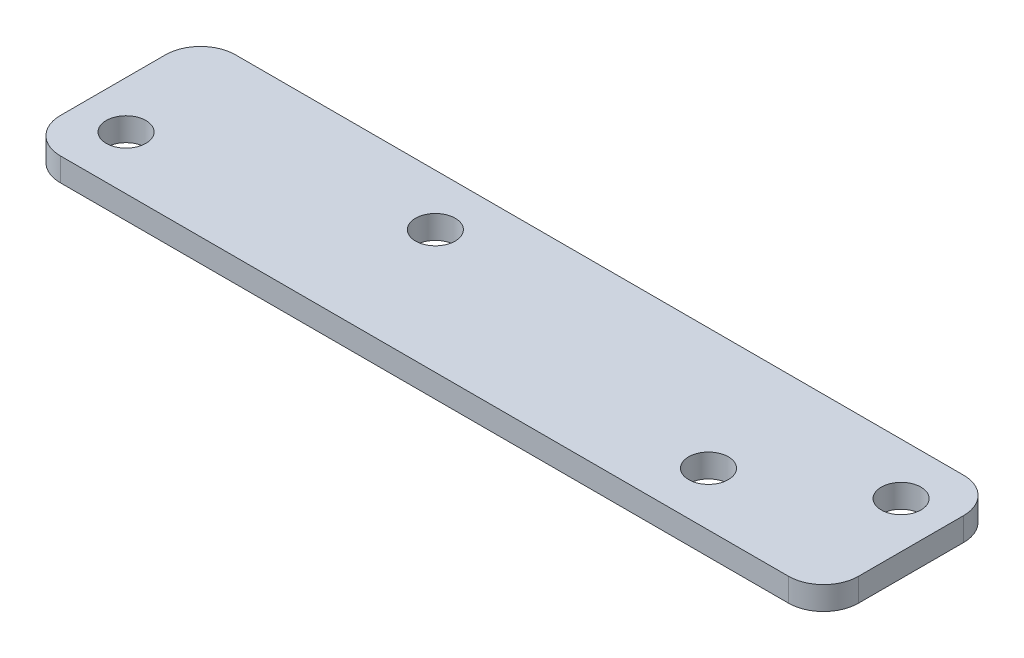
ISO-10303-21;
HEADER;
FILE_DESCRIPTION(('STEP AP214'),'2;1');
FILE_NAME('part.step','',(''),(''),'','','');
FILE_SCHEMA(('AUTOMOTIVE_DESIGN { 1 0 10303 214 1 1 1 1 }'));
ENDSEC;
DATA;
#1=APPLICATION_CONTEXT('core data for automotive mechanical design processes');
#2=APPLICATION_PROTOCOL_DEFINITION('international standard','automotive_design',2000,#1);
#3=PRODUCT_CONTEXT('',#1,'mechanical');
#4=PRODUCT('Part','Part','',(#3));
#5=PRODUCT_RELATED_PRODUCT_CATEGORY('part','',(#4));
#6=PRODUCT_DEFINITION_FORMATION('','',#4);
#7=PRODUCT_DEFINITION_CONTEXT('part definition',#1,'design');
#8=PRODUCT_DEFINITION('design','',#6,#7);
#9=PRODUCT_DEFINITION_SHAPE('','',#8);
#10=(LENGTH_UNIT() NAMED_UNIT(*) SI_UNIT(.MILLI.,.METRE.));
#11=(NAMED_UNIT(*) PLANE_ANGLE_UNIT() SI_UNIT($,.RADIAN.));
#12=(NAMED_UNIT(*) SI_UNIT($,.STERADIAN.) SOLID_ANGLE_UNIT());
#13=UNCERTAINTY_MEASURE_WITH_UNIT(LENGTH_MEASURE(1.E-05),#10,'distance_accuracy_value','');
#14=(GEOMETRIC_REPRESENTATION_CONTEXT(3) GLOBAL_UNCERTAINTY_ASSIGNED_CONTEXT((#13)) GLOBAL_UNIT_ASSIGNED_CONTEXT((#10,
#11,#12)) REPRESENTATION_CONTEXT('',''));
#15=CARTESIAN_POINT('',(0.,0.,0.));
#16=DIRECTION('',(0.,0.,1.));
#17=DIRECTION('',(1.,0.,0.));
#18=AXIS2_PLACEMENT_3D('',#15,#16,#17);
#19=CARTESIAN_POINT('',(-45.1802721977197,2.,13.3464138420318));
#20=DIRECTION('',(0.,1.,0.));
#21=DIRECTION('',(0.,0.,1.));
#22=AXIS2_PLACEMENT_3D('',#19,#20,#21);
#23=PLANE('',#22);
#24=CARTESIAN_POINT('',(-106.522840672689,2.,11.7573842534929));
#25=DIRECTION('',(0.,1.,0.));
#26=DIRECTION('',(0.,0.,1.));
#27=AXIS2_PLACEMENT_3D('',#24,#25,#26);
#28=CIRCLE('',#27,1.7);
#29=CARTESIAN_POINT('',(-106.522840672689,2.,13.4573842534929));
#30=VERTEX_POINT('',#29);
#31=EDGE_CURVE('E225',#30,#30,#28,.T.);
#32=ORIENTED_EDGE('',*,*,#31,.F.);
#33=EDGE_LOOP('',(#32));
#34=FACE_BOUND('',#33,.T.);
#35=CARTESIAN_POINT('',(-86.0228406726891,2.,5.75738425349294));
#36=DIRECTION('',(0.,1.,0.));
#37=DIRECTION('',(0.,0.,1.));
#38=AXIS2_PLACEMENT_3D('',#35,#36,#37);
#39=CIRCLE('',#38,1.7);
#40=CARTESIAN_POINT('',(-86.0228406726891,2.,7.45738425349294));
#41=VERTEX_POINT('',#40);
#42=EDGE_CURVE('E150',#41,#41,#39,.T.);
#43=ORIENTED_EDGE('',*,*,#42,.F.);
#44=EDGE_LOOP('',(#43));
#45=FACE_BOUND('',#44,.T.);
#46=CARTESIAN_POINT('',(-45.1802721977197,2.,13.3464138420318));
#47=DIRECTION('',(0.,1.,0.));
#48=DIRECTION('',(0.,0.,1.));
#49=AXIS2_PLACEMENT_3D('',#46,#47,#48);
#50=CIRCLE('',#49,3.);
#51=CARTESIAN_POINT('',(-45.1802721977197,2.,16.3464138420318));
#52=VERTEX_POINT('',#51);
#53=CARTESIAN_POINT('',(-42.1802721977197,2.,13.3464138420317));
#54=VERTEX_POINT('',#53);
#55=EDGE_CURVE('E168',#52,#54,#50,.T.);
#56=ORIENTED_EDGE('',*,*,#55,.T.);
#57=DIRECTION('',(0.,0.,-1.));
#58=VECTOR('',#57,1.);
#59=CARTESIAN_POINT('',(-42.1802721977197,2.,4.34641384203178));
#60=LINE('',#59,#58);
#61=CARTESIAN_POINT('',(-42.1802721977197,2.,4.34641384203178));
#62=VERTEX_POINT('',#61);
#63=EDGE_CURVE('E104',#54,#62,#60,.T.);
#64=ORIENTED_EDGE('',*,*,#63,.T.);
#65=CARTESIAN_POINT('',(-45.1802721977197,2.,4.34641384203176));
#66=DIRECTION('',(0.,1.,0.));
#67=DIRECTION('',(0.,0.,-1.));
#68=AXIS2_PLACEMENT_3D('',#65,#66,#67);
#69=CIRCLE('',#68,3.);
#70=CARTESIAN_POINT('',(-45.1802721977197,2.,1.34641384203176));
#71=VERTEX_POINT('',#70);
#72=EDGE_CURVE('E189',#62,#71,#69,.T.);
#73=ORIENTED_EDGE('',*,*,#72,.T.);
#74=DIRECTION('',(-1.,0.,0.));
#75=VECTOR('',#74,1.);
#76=CARTESIAN_POINT('',(-107.557379253952,2.,1.34641384203176));
#77=LINE('',#76,#75);
#78=CARTESIAN_POINT('',(-107.557379253952,2.,1.34641384203176));
#79=VERTEX_POINT('',#78);
#80=EDGE_CURVE('E203',#71,#79,#77,.T.);
#81=ORIENTED_EDGE('',*,*,#80,.T.);
#82=CARTESIAN_POINT('',(-107.557379253952,2.,4.34641384203176));
#83=DIRECTION('',(0.,1.,0.));
#84=DIRECTION('',(0.,0.,1.));
#85=AXIS2_PLACEMENT_3D('',#82,#83,#84);
#86=CIRCLE('',#85,3.);
#87=CARTESIAN_POINT('',(-110.557379253952,2.,4.34641384203178));
#88=VERTEX_POINT('',#87);
#89=EDGE_CURVE('E123',#79,#88,#86,.T.);
#90=ORIENTED_EDGE('',*,*,#89,.T.);
#91=DIRECTION('',(0.,0.,1.));
#92=VECTOR('',#91,1.);
#93=CARTESIAN_POINT('',(-110.557379253952,2.,4.34641384203178));
#94=LINE('',#93,#92);
#95=CARTESIAN_POINT('',(-110.557379253952,2.,13.3464138420317));
#96=VERTEX_POINT('',#95);
#97=EDGE_CURVE('E117',#88,#96,#94,.T.);
#98=ORIENTED_EDGE('',*,*,#97,.T.);
#99=CARTESIAN_POINT('',(-107.557379253952,2.,13.3464138420318));
#100=DIRECTION('',(0.,1.,0.));
#101=DIRECTION('',(0.,0.,1.));
#102=AXIS2_PLACEMENT_3D('',#99,#100,#101);
#103=CIRCLE('',#102,3.);
#104=CARTESIAN_POINT('',(-107.557379253952,2.,16.3464138420318));
#105=VERTEX_POINT('',#104);
#106=EDGE_CURVE('E121',#96,#105,#103,.T.);
#107=ORIENTED_EDGE('',*,*,#106,.T.);
#108=DIRECTION('',(1.,0.,0.));
#109=VECTOR('',#108,1.);
#110=CARTESIAN_POINT('',(-107.557379253952,2.,16.3464138420318));
#111=LINE('',#110,#109);
#112=EDGE_CURVE('E61',#105,#52,#111,.T.);
#113=ORIENTED_EDGE('',*,*,#112,.T.);
#114=EDGE_LOOP('',(#56,#64,#73,#81,#90,#98,#107,#113));
#115=FACE_BOUND('',#114,.T.);
#116=CARTESIAN_POINT('',(-46.1228406726891,2.,5.75738425349294));
#117=DIRECTION('',(0.,1.,0.));
#118=DIRECTION('',(0.,0.,1.));
#119=AXIS2_PLACEMENT_3D('',#116,#117,#118);
#120=CIRCLE('',#119,1.7);
#121=CARTESIAN_POINT('',(-46.1228406726891,2.,7.45738425349294));
#122=VERTEX_POINT('',#121);
#123=EDGE_CURVE('E217',#122,#122,#120,.T.);
#124=ORIENTED_EDGE('',*,*,#123,.F.);
#125=EDGE_LOOP('',(#124));
#126=FACE_BOUND('',#125,.T.);
#127=CARTESIAN_POINT('',(-56.6228406726891,2.,11.7573842534929));
#128=DIRECTION('',(0.,1.,0.));
#129=DIRECTION('',(0.,0.,1.));
#130=AXIS2_PLACEMENT_3D('',#127,#128,#129);
#131=CIRCLE('',#130,1.7);
#132=CARTESIAN_POINT('',(-56.6228406726891,2.,13.4573842534929));
#133=VERTEX_POINT('',#132);
#134=EDGE_CURVE('E233',#133,#133,#131,.T.);
#135=ORIENTED_EDGE('',*,*,#134,.F.);
#136=EDGE_LOOP('',(#135));
#137=FACE_BOUND('',#136,.T.);
#138=ADVANCED_FACE('F43',(#34,#45,#115,#126,#137),#23,.T.);
#139=CARTESIAN_POINT('',(-45.1802721977197,0.,13.3464138420318));
#140=DIRECTION('',(0.,1.,0.));
#141=DIRECTION('',(0.,0.,1.));
#142=AXIS2_PLACEMENT_3D('',#139,#140,#141);
#143=PLANE('',#142);
#144=CARTESIAN_POINT('',(-45.1802721977197,0.,13.3464138420318));
#145=DIRECTION('',(0.,1.,0.));
#146=DIRECTION('',(0.,0.,1.));
#147=AXIS2_PLACEMENT_3D('',#144,#145,#146);
#148=CIRCLE('',#147,3.);
#149=CARTESIAN_POINT('',(-45.1802721977197,0.,16.3464138420318));
#150=VERTEX_POINT('',#149);
#151=CARTESIAN_POINT('',(-42.1802721977197,0.,13.3464138420317));
#152=VERTEX_POINT('',#151);
#153=EDGE_CURVE('E145',#150,#152,#148,.T.);
#154=ORIENTED_EDGE('',*,*,#153,.F.);
#155=DIRECTION('',(1.,0.,0.));
#156=VECTOR('',#155,1.);
#157=CARTESIAN_POINT('',(-107.557379253952,0.,16.3464138420318));
#158=LINE('',#157,#156);
#159=CARTESIAN_POINT('',(-107.557379253952,0.,16.3464138420318));
#160=VERTEX_POINT('',#159);
#161=EDGE_CURVE('E96',#160,#150,#158,.T.);
#162=ORIENTED_EDGE('',*,*,#161,.F.);
#163=CARTESIAN_POINT('',(-107.557379253952,0.,13.3464138420318));
#164=DIRECTION('',(0.,1.,0.));
#165=DIRECTION('',(0.,0.,1.));
#166=AXIS2_PLACEMENT_3D('',#163,#164,#165);
#167=CIRCLE('',#166,3.);
#168=CARTESIAN_POINT('',(-110.557379253952,0.,13.3464138420317));
#169=VERTEX_POINT('',#168);
#170=EDGE_CURVE('E90',#169,#160,#167,.T.);
#171=ORIENTED_EDGE('',*,*,#170,.F.);
#172=DIRECTION('',(0.,0.,1.));
#173=VECTOR('',#172,1.);
#174=CARTESIAN_POINT('',(-110.557379253952,0.,4.34641384203178));
#175=LINE('',#174,#173);
#176=CARTESIAN_POINT('',(-110.557379253952,0.,4.34641384203178));
#177=VERTEX_POINT('',#176);
#178=EDGE_CURVE('E132',#177,#169,#175,.T.);
#179=ORIENTED_EDGE('',*,*,#178,.F.);
#180=CARTESIAN_POINT('',(-107.557379253952,0.,4.34641384203176));
#181=DIRECTION('',(0.,1.,0.));
#182=DIRECTION('',(0.,0.,1.));
#183=AXIS2_PLACEMENT_3D('',#180,#181,#182);
#184=CIRCLE('',#183,3.);
#185=CARTESIAN_POINT('',(-107.557379253952,0.,1.34641384203176));
#186=VERTEX_POINT('',#185);
#187=EDGE_CURVE('E159',#186,#177,#184,.T.);
#188=ORIENTED_EDGE('',*,*,#187,.F.);
#189=DIRECTION('',(-1.,0.,0.));
#190=VECTOR('',#189,1.);
#191=CARTESIAN_POINT('',(-107.557379253952,0.,1.34641384203176));
#192=LINE('',#191,#190);
#193=CARTESIAN_POINT('',(-45.1802721977197,0.,1.34641384203176));
#194=VERTEX_POINT('',#193);
#195=EDGE_CURVE('E156',#194,#186,#192,.T.);
#196=ORIENTED_EDGE('',*,*,#195,.F.);
#197=CARTESIAN_POINT('',(-45.1802721977197,0.,4.34641384203176));
#198=DIRECTION('',(0.,1.,0.));
#199=DIRECTION('',(0.,0.,-1.));
#200=AXIS2_PLACEMENT_3D('',#197,#198,#199);
#201=CIRCLE('',#200,3.);
#202=CARTESIAN_POINT('',(-42.1802721977197,0.,4.34641384203178));
#203=VERTEX_POINT('',#202);
#204=EDGE_CURVE('E153',#203,#194,#201,.T.);
#205=ORIENTED_EDGE('',*,*,#204,.F.);
#206=DIRECTION('',(0.,0.,-1.));
#207=VECTOR('',#206,1.);
#208=CARTESIAN_POINT('',(-42.1802721977197,0.,4.34641384203178));
#209=LINE('',#208,#207);
#210=EDGE_CURVE('E149',#152,#203,#209,.T.);
#211=ORIENTED_EDGE('',*,*,#210,.F.);
#212=EDGE_LOOP('',(#154,#162,#171,#179,#188,#196,#205,#211));
#213=FACE_BOUND('',#212,.T.);
#214=CARTESIAN_POINT('',(-86.0228406726891,0.,5.75738425349294));
#215=DIRECTION('',(0.,1.,0.));
#216=DIRECTION('',(0.,0.,1.));
#217=AXIS2_PLACEMENT_3D('',#214,#215,#216);
#218=CIRCLE('',#217,1.7);
#219=CARTESIAN_POINT('',(-86.0228406726891,0.,7.45738425349294));
#220=VERTEX_POINT('',#219);
#221=EDGE_CURVE('E213',#220,#220,#218,.T.);
#222=ORIENTED_EDGE('',*,*,#221,.T.);
#223=EDGE_LOOP('',(#222));
#224=FACE_BOUND('',#223,.T.);
#225=CARTESIAN_POINT('',(-46.1228406726891,0.,5.75738425349294));
#226=DIRECTION('',(0.,1.,0.));
#227=DIRECTION('',(0.,0.,1.));
#228=AXIS2_PLACEMENT_3D('',#225,#226,#227);
#229=CIRCLE('',#228,1.7);
#230=CARTESIAN_POINT('',(-46.1228406726891,0.,7.45738425349294));
#231=VERTEX_POINT('',#230);
#232=EDGE_CURVE('E221',#231,#231,#229,.T.);
#233=ORIENTED_EDGE('',*,*,#232,.T.);
#234=EDGE_LOOP('',(#233));
#235=FACE_BOUND('',#234,.T.);
#236=CARTESIAN_POINT('',(-106.522840672689,0.,11.7573842534929));
#237=DIRECTION('',(0.,1.,0.));
#238=DIRECTION('',(0.,0.,1.));
#239=AXIS2_PLACEMENT_3D('',#236,#237,#238);
#240=CIRCLE('',#239,1.7);
#241=CARTESIAN_POINT('',(-106.522840672689,0.,13.4573842534929));
#242=VERTEX_POINT('',#241);
#243=EDGE_CURVE('E229',#242,#242,#240,.T.);
#244=ORIENTED_EDGE('',*,*,#243,.T.);
#245=EDGE_LOOP('',(#244));
#246=FACE_BOUND('',#245,.T.);
#247=CARTESIAN_POINT('',(-56.6228406726891,0.,11.7573842534929));
#248=DIRECTION('',(0.,1.,0.));
#249=DIRECTION('',(0.,0.,1.));
#250=AXIS2_PLACEMENT_3D('',#247,#248,#249);
#251=CIRCLE('',#250,1.7);
#252=CARTESIAN_POINT('',(-56.6228406726891,0.,13.4573842534929));
#253=VERTEX_POINT('',#252);
#254=EDGE_CURVE('E237',#253,#253,#251,.T.);
#255=ORIENTED_EDGE('',*,*,#254,.T.);
#256=EDGE_LOOP('',(#255));
#257=FACE_BOUND('',#256,.T.);
#258=ADVANCED_FACE('F193',(#213,#224,#235,#246,#257),#143,.F.);
#259=CARTESIAN_POINT('',(-45.1802721977197,2.,13.3464138420318));
#260=DIRECTION('',(0.,-1.,0.));
#261=DIRECTION('',(0.,0.,-1.));
#262=AXIS2_PLACEMENT_3D('',#259,#260,#261);
#263=CYLINDRICAL_SURFACE('',#262,3.);
#264=ORIENTED_EDGE('',*,*,#153,.T.);
#265=DIRECTION('',(0.,-1.,0.));
#266=VECTOR('',#265,1.);
#267=CARTESIAN_POINT('',(-42.1802721977197,2.,13.3464138420317));
#268=LINE('',#267,#266);
#269=EDGE_CURVE('E11',#54,#152,#268,.T.);
#270=ORIENTED_EDGE('',*,*,#269,.F.);
#271=ORIENTED_EDGE('',*,*,#55,.F.);
#272=DIRECTION('',(0.,-1.,0.));
#273=VECTOR('',#272,1.);
#274=CARTESIAN_POINT('',(-45.1802721977197,2.,16.3464138420318));
#275=LINE('',#274,#273);
#276=EDGE_CURVE('E141',#52,#150,#275,.T.);
#277=ORIENTED_EDGE('',*,*,#276,.T.);
#278=EDGE_LOOP('',(#264,#270,#271,#277));
#279=FACE_BOUND('',#278,.T.);
#280=ADVANCED_FACE('F45',(#279),#263,.T.);
#281=CARTESIAN_POINT('',(-42.1802721977197,2.,4.34641384203178));
#282=DIRECTION('',(-1.,0.,0.));
#283=DIRECTION('',(0.,0.,1.));
#284=AXIS2_PLACEMENT_3D('',#281,#282,#283);
#285=PLANE('',#284);
#286=ORIENTED_EDGE('',*,*,#210,.T.);
#287=DIRECTION('',(0.,-1.,0.));
#288=VECTOR('',#287,1.);
#289=CARTESIAN_POINT('',(-42.1802721977197,2.,4.34641384203178));
#290=LINE('',#289,#288);
#291=EDGE_CURVE('E53',#62,#203,#290,.T.);
#292=ORIENTED_EDGE('',*,*,#291,.F.);
#293=ORIENTED_EDGE('',*,*,#63,.F.);
#294=ORIENTED_EDGE('',*,*,#269,.T.);
#295=EDGE_LOOP('',(#286,#292,#293,#294));
#296=FACE_BOUND('',#295,.T.);
#297=ADVANCED_FACE('F273',(#296),#285,.F.);
#298=CARTESIAN_POINT('',(-45.1802721977197,2.,4.34641384203176));
#299=DIRECTION('',(0.,-1.,0.));
#300=DIRECTION('',(0.,0.,-1.));
#301=AXIS2_PLACEMENT_3D('',#298,#299,#300);
#302=CYLINDRICAL_SURFACE('',#301,3.);
#303=ORIENTED_EDGE('',*,*,#204,.T.);
#304=DIRECTION('',(0.,-1.,0.));
#305=VECTOR('',#304,1.);
#306=CARTESIAN_POINT('',(-45.1802721977197,2.,1.34641384203176));
#307=LINE('',#306,#305);
#308=EDGE_CURVE('E179',#71,#194,#307,.T.);
#309=ORIENTED_EDGE('',*,*,#308,.F.);
#310=ORIENTED_EDGE('',*,*,#72,.F.);
#311=ORIENTED_EDGE('',*,*,#291,.T.);
#312=EDGE_LOOP('',(#303,#309,#310,#311));
#313=FACE_BOUND('',#312,.T.);
#314=ADVANCED_FACE('F187',(#313),#302,.T.);
#315=CARTESIAN_POINT('',(-107.557379253952,2.,1.34641384203176));
#316=DIRECTION('',(0.,0.,1.));
#317=DIRECTION('',(1.,0.,0.));
#318=AXIS2_PLACEMENT_3D('',#315,#316,#317);
#319=PLANE('',#318);
#320=ORIENTED_EDGE('',*,*,#195,.T.);
#321=DIRECTION('',(0.,-1.,0.));
#322=VECTOR('',#321,1.);
#323=CARTESIAN_POINT('',(-107.557379253952,2.,1.34641384203176));
#324=LINE('',#323,#322);
#325=EDGE_CURVE('E175',#79,#186,#324,.T.);
#326=ORIENTED_EDGE('',*,*,#325,.F.);
#327=ORIENTED_EDGE('',*,*,#80,.F.);
#328=ORIENTED_EDGE('',*,*,#308,.T.);
#329=EDGE_LOOP('',(#320,#326,#327,#328));
#330=FACE_BOUND('',#329,.T.);
#331=ADVANCED_FACE('F198',(#330),#319,.F.);
#332=CARTESIAN_POINT('',(-107.557379253952,2.,4.34641384203176));
#333=DIRECTION('',(0.,-1.,0.));
#334=DIRECTION('',(0.,0.,-1.));
#335=AXIS2_PLACEMENT_3D('',#332,#333,#334);
#336=CYLINDRICAL_SURFACE('',#335,3.);
#337=ORIENTED_EDGE('',*,*,#187,.T.);
#338=DIRECTION('',(0.,-1.,0.));
#339=VECTOR('',#338,1.);
#340=CARTESIAN_POINT('',(-110.557379253952,2.,4.34641384203178));
#341=LINE('',#340,#339);
#342=EDGE_CURVE('E134',#88,#177,#341,.T.);
#343=ORIENTED_EDGE('',*,*,#342,.F.);
#344=ORIENTED_EDGE('',*,*,#89,.F.);
#345=ORIENTED_EDGE('',*,*,#325,.T.);
#346=EDGE_LOOP('',(#337,#343,#344,#345));
#347=FACE_BOUND('',#346,.T.);
#348=ADVANCED_FACE('F201',(#347),#336,.T.);
#349=CARTESIAN_POINT('',(-110.557379253952,2.,4.34641384203178));
#350=DIRECTION('',(1.,0.,0.));
#351=DIRECTION('',(0.,0.,-1.));
#352=AXIS2_PLACEMENT_3D('',#349,#350,#351);
#353=PLANE('',#352);
#354=ORIENTED_EDGE('',*,*,#178,.T.);
#355=DIRECTION('',(0.,-1.,0.));
#356=VECTOR('',#355,1.);
#357=CARTESIAN_POINT('',(-110.557379253952,2.,13.3464138420317));
#358=LINE('',#357,#356);
#359=EDGE_CURVE('E129',#96,#169,#358,.T.);
#360=ORIENTED_EDGE('',*,*,#359,.F.);
#361=ORIENTED_EDGE('',*,*,#97,.F.);
#362=ORIENTED_EDGE('',*,*,#342,.T.);
#363=EDGE_LOOP('',(#354,#360,#361,#362));
#364=FACE_BOUND('',#363,.T.);
#365=ADVANCED_FACE('F130',(#364),#353,.F.);
#366=CARTESIAN_POINT('',(-107.557379253952,2.,13.3464138420318));
#367=DIRECTION('',(0.,-1.,0.));
#368=DIRECTION('',(0.,0.,-1.));
#369=AXIS2_PLACEMENT_3D('',#366,#367,#368);
#370=CYLINDRICAL_SURFACE('',#369,3.);
#371=ORIENTED_EDGE('',*,*,#170,.T.);
#372=DIRECTION('',(0.,-1.,0.));
#373=VECTOR('',#372,1.);
#374=CARTESIAN_POINT('',(-107.557379253952,2.,16.3464138420318));
#375=LINE('',#374,#373);
#376=EDGE_CURVE('E135',#105,#160,#375,.T.);
#377=ORIENTED_EDGE('',*,*,#376,.F.);
#378=ORIENTED_EDGE('',*,*,#106,.F.);
#379=ORIENTED_EDGE('',*,*,#359,.T.);
#380=EDGE_LOOP('',(#371,#377,#378,#379));
#381=FACE_BOUND('',#380,.T.);
#382=ADVANCED_FACE('F137',(#381),#370,.T.);
#383=CARTESIAN_POINT('',(-107.557379253952,2.,16.3464138420318));
#384=DIRECTION('',(0.,0.,-1.));
#385=DIRECTION('',(-1.,0.,0.));
#386=AXIS2_PLACEMENT_3D('',#383,#384,#385);
#387=PLANE('',#386);
#388=ORIENTED_EDGE('',*,*,#161,.T.);
#389=ORIENTED_EDGE('',*,*,#276,.F.);
#390=ORIENTED_EDGE('',*,*,#112,.F.);
#391=ORIENTED_EDGE('',*,*,#376,.T.);
#392=EDGE_LOOP('',(#388,#389,#390,#391));
#393=FACE_BOUND('',#392,.T.);
#394=ADVANCED_FACE('F261',(#393),#387,.F.);
#395=CARTESIAN_POINT('',(-86.0228406726891,2.,5.75738425349294));
#396=DIRECTION('',(0.,-1.,0.));
#397=DIRECTION('',(0.,0.,-1.));
#398=AXIS2_PLACEMENT_3D('',#395,#396,#397);
#399=CYLINDRICAL_SURFACE('',#398,1.7);
#400=ORIENTED_EDGE('',*,*,#42,.T.);
#401=EDGE_LOOP('',(#400));
#402=FACE_BOUND('',#401,.T.);
#403=ORIENTED_EDGE('',*,*,#221,.F.);
#404=EDGE_LOOP('',(#403));
#405=FACE_BOUND('',#404,.T.);
#406=ADVANCED_FACE('F258',(#402,#405),#399,.F.);
#407=CARTESIAN_POINT('',(-46.1228406726891,2.,5.75738425349294));
#408=DIRECTION('',(0.,-1.,0.));
#409=DIRECTION('',(0.,0.,-1.));
#410=AXIS2_PLACEMENT_3D('',#407,#408,#409);
#411=CYLINDRICAL_SURFACE('',#410,1.7);
#412=ORIENTED_EDGE('',*,*,#123,.T.);
#413=EDGE_LOOP('',(#412));
#414=FACE_BOUND('',#413,.T.);
#415=ORIENTED_EDGE('',*,*,#232,.F.);
#416=EDGE_LOOP('',(#415));
#417=FACE_BOUND('',#416,.T.);
#418=ADVANCED_FACE('F349',(#414,#417),#411,.F.);
#419=CARTESIAN_POINT('',(-106.522840672689,2.,11.7573842534929));
#420=DIRECTION('',(0.,-1.,0.));
#421=DIRECTION('',(0.,0.,-1.));
#422=AXIS2_PLACEMENT_3D('',#419,#420,#421);
#423=CYLINDRICAL_SURFACE('',#422,1.7);
#424=ORIENTED_EDGE('',*,*,#31,.T.);
#425=EDGE_LOOP('',(#424));
#426=FACE_BOUND('',#425,.T.);
#427=ORIENTED_EDGE('',*,*,#243,.F.);
#428=EDGE_LOOP('',(#427));
#429=FACE_BOUND('',#428,.T.);
#430=ADVANCED_FACE('F358',(#426,#429),#423,.F.);
#431=CARTESIAN_POINT('',(-56.6228406726891,2.,11.7573842534929));
#432=DIRECTION('',(0.,-1.,0.));
#433=DIRECTION('',(0.,0.,-1.));
#434=AXIS2_PLACEMENT_3D('',#431,#432,#433);
#435=CYLINDRICAL_SURFACE('',#434,1.7);
#436=ORIENTED_EDGE('',*,*,#134,.T.);
#437=EDGE_LOOP('',(#436));
#438=FACE_BOUND('',#437,.T.);
#439=ORIENTED_EDGE('',*,*,#254,.F.);
#440=EDGE_LOOP('',(#439));
#441=FACE_BOUND('',#440,.T.);
#442=ADVANCED_FACE('F245',(#438,#441),#435,.F.);
#443=CLOSED_SHELL('',(#138,#258,#280,#297,#314,#331,#348,#365,#382,#394,#406,#418,#430,#442));
#444=MANIFOLD_SOLID_BREP('B2',#443);
#445=ADVANCED_BREP_SHAPE_REPRESENTATION('',(#18,#444),#14);
#446=SHAPE_DEFINITION_REPRESENTATION(#9,#445);
ENDSEC;
END-ISO-10303-21;
